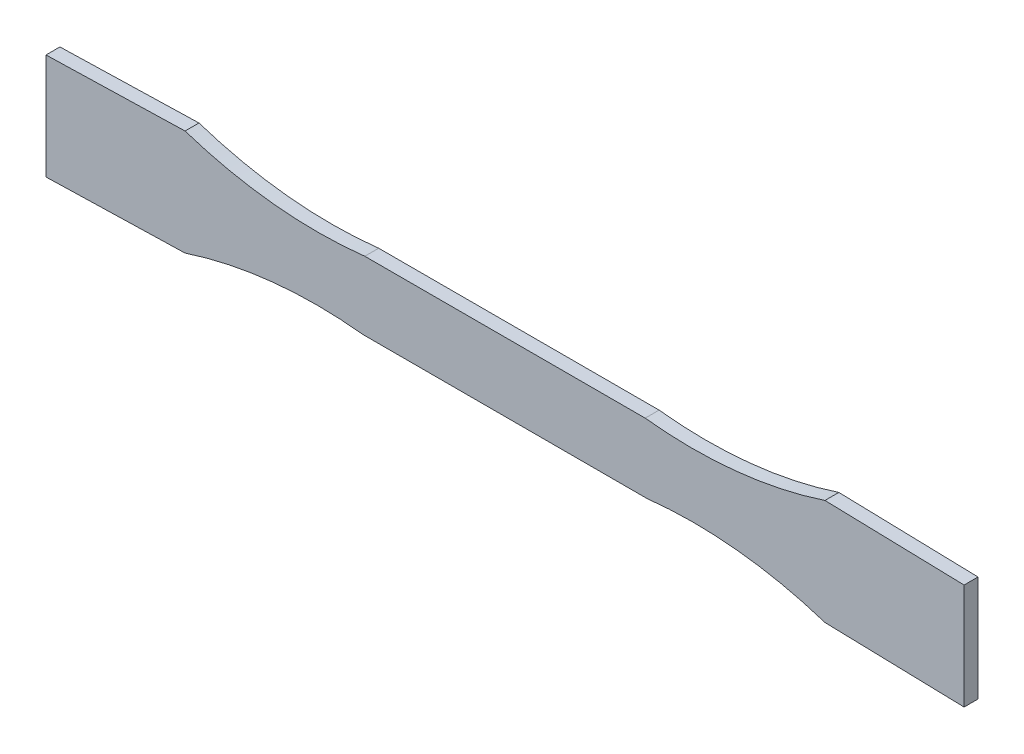
ISO-10303-21;
HEADER;
FILE_DESCRIPTION(('STEP AP214'),'2;1');
FILE_NAME('part.step','',(''),(''),'','','');
FILE_SCHEMA(('AUTOMOTIVE_DESIGN { 1 0 10303 214 1 1 1 1 }'));
ENDSEC;
DATA;
#1=APPLICATION_CONTEXT('core data for automotive mechanical design processes');
#2=APPLICATION_PROTOCOL_DEFINITION('international standard','automotive_design',2000,#1);
#3=PRODUCT_CONTEXT('',#1,'mechanical');
#4=PRODUCT('Part','Part','',(#3));
#5=PRODUCT_RELATED_PRODUCT_CATEGORY('part','',(#4));
#6=PRODUCT_DEFINITION_FORMATION('','',#4);
#7=PRODUCT_DEFINITION_CONTEXT('part definition',#1,'design');
#8=PRODUCT_DEFINITION('design','',#6,#7);
#9=PRODUCT_DEFINITION_SHAPE('','',#8);
#10=(LENGTH_UNIT() NAMED_UNIT(*) SI_UNIT(.MILLI.,.METRE.));
#11=(NAMED_UNIT(*) PLANE_ANGLE_UNIT() SI_UNIT($,.RADIAN.));
#12=(NAMED_UNIT(*) SI_UNIT($,.STERADIAN.) SOLID_ANGLE_UNIT());
#13=UNCERTAINTY_MEASURE_WITH_UNIT(LENGTH_MEASURE(1.E-05),#10,'distance_accuracy_value','');
#14=(GEOMETRIC_REPRESENTATION_CONTEXT(3) GLOBAL_UNCERTAINTY_ASSIGNED_CONTEXT((#13)) GLOBAL_UNIT_ASSIGNED_CONTEXT((#10,
#11,#12)) REPRESENTATION_CONTEXT('',''));
#15=CARTESIAN_POINT('',(0.,0.,0.));
#16=DIRECTION('',(0.,0.,1.));
#17=DIRECTION('',(1.,0.,0.));
#18=AXIS2_PLACEMENT_3D('',#15,#16,#17);
#19=CARTESIAN_POINT('',(0.306287384708204,11.6450756614139,2.5));
#20=DIRECTION('',(-0.0262927872209674,-0.999654284910615,0.));
#21=DIRECTION('',(0.999654284910615,-0.0262927872209674,0.));
#22=AXIS2_PLACEMENT_3D('',#19,#20,#21);
#23=PLANE('',#22);
#24=DIRECTION('',(-0.999654284910615,0.0262927872209674,0.));
#25=VECTOR('',#24,1.);
#26=CARTESIAN_POINT('',(0.306287384708204,11.6450756614139,0.));
#27=LINE('',#26,#25);
#28=CARTESIAN_POINT('',(118.382619236994,8.53944612919812,0.));
#29=VERTEX_POINT('',#28);
#30=CARTESIAN_POINT('',(93.3739643892406,9.19722077241228,0.));
#31=VERTEX_POINT('',#30);
#32=EDGE_CURVE('E157',#29,#31,#27,.T.);
#33=ORIENTED_EDGE('',*,*,#32,.T.);
#34=DIRECTION('',(0.,0.,-1.));
#35=VECTOR('',#34,1.);
#36=CARTESIAN_POINT('',(93.3739643892406,9.19722077241228,2.5));
#37=LINE('',#36,#35);
#38=CARTESIAN_POINT('',(93.3739643892406,9.19722077241228,2.5));
#39=VERTEX_POINT('',#38);
#40=EDGE_CURVE('E11',#39,#31,#37,.T.);
#41=ORIENTED_EDGE('',*,*,#40,.F.);
#42=DIRECTION('',(-0.999654284910615,0.0262927872209674,0.));
#43=VECTOR('',#42,1.);
#44=CARTESIAN_POINT('',(0.306287384708204,11.6450756614139,2.5));
#45=LINE('',#44,#43);
#46=CARTESIAN_POINT('',(118.382619236994,8.53944612919812,2.5));
#47=VERTEX_POINT('',#46);
#48=EDGE_CURVE('E186',#47,#39,#45,.T.);
#49=ORIENTED_EDGE('',*,*,#48,.F.);
#50=DIRECTION('',(0.,0.,-1.));
#51=VECTOR('',#50,1.);
#52=CARTESIAN_POINT('',(118.382619236994,8.53944612919812,2.5));
#53=LINE('',#52,#51);
#54=EDGE_CURVE('E53',#47,#29,#53,.T.);
#55=ORIENTED_EDGE('',*,*,#54,.T.);
#56=EDGE_LOOP('',(#33,#41,#49,#55));
#57=FACE_BOUND('',#56,.T.);
#58=ADVANCED_FACE('F37',(#57),#23,.F.);
#59=CARTESIAN_POINT('',(69.5821339937692,81.3771958793152,2.5));
#60=DIRECTION('',(0.,0.,-1.));
#61=DIRECTION('',(-1.,0.,0.));
#62=AXIS2_PLACEMENT_3D('',#59,#60,#61);
#63=CYLINDRICAL_SURFACE('',#62,76.);
#64=CARTESIAN_POINT('',(69.5821339937692,81.3771958793152,0.));
#65=DIRECTION('',(0.,0.,1.));
#66=DIRECTION('',(1.,0.,0.));
#67=AXIS2_PLACEMENT_3D('',#64,#65,#66);
#68=CIRCLE('',#67,76.);
#69=CARTESIAN_POINT('',(61.0678248014905,5.85563247535567,0.));
#70=VERTEX_POINT('',#69);
#71=EDGE_CURVE('E159',#31,#70,#68,.F.);
#72=ORIENTED_EDGE('',*,*,#71,.T.);
#73=DIRECTION('',(0.,0.,-1.));
#74=VECTOR('',#73,1.);
#75=CARTESIAN_POINT('',(61.0678248014905,5.85563247535567,2.5));
#76=LINE('',#75,#74);
#77=CARTESIAN_POINT('',(61.0678248014905,5.85563247535567,2.5));
#78=VERTEX_POINT('',#77);
#79=EDGE_CURVE('E45',#78,#70,#76,.T.);
#80=ORIENTED_EDGE('',*,*,#79,.F.);
#81=CARTESIAN_POINT('',(69.5821339937692,81.3771958793152,2.5));
#82=DIRECTION('',(0.,0.,1.));
#83=DIRECTION('',(1.,0.,0.));
#84=AXIS2_PLACEMENT_3D('',#81,#82,#83);
#85=CIRCLE('',#84,76.);
#86=EDGE_CURVE('E103',#39,#78,#85,.F.);
#87=ORIENTED_EDGE('',*,*,#86,.F.);
#88=ORIENTED_EDGE('',*,*,#40,.T.);
#89=EDGE_LOOP('',(#72,#80,#87,#88));
#90=FACE_BOUND('',#89,.T.);
#91=ADVANCED_FACE('F210',(#90),#63,.F.);
#92=CARTESIAN_POINT('',(0.,5.85563247535567,2.5));
#93=DIRECTION('',(0.,1.,0.));
#94=DIRECTION('',(0.,0.,1.));
#95=AXIS2_PLACEMENT_3D('',#92,#93,#94);
#96=PLANE('',#95);
#97=DIRECTION('',(1.,0.,0.));
#98=VECTOR('',#97,1.);
#99=CARTESIAN_POINT('',(0.,5.85563247535567,0.));
#100=LINE('',#99,#98);
#101=CARTESIAN_POINT('',(10.6759845941212,5.85563247535567,0.));
#102=VERTEX_POINT('',#101);
#103=EDGE_CURVE('E162',#102,#70,#100,.T.);
#104=ORIENTED_EDGE('',*,*,#103,.F.);
#105=DIRECTION('',(0.,0.,-1.));
#106=VECTOR('',#105,1.);
#107=CARTESIAN_POINT('',(10.6759845941212,5.85563247535567,2.5));
#108=LINE('',#107,#106);
#109=CARTESIAN_POINT('',(10.6759845941212,5.85563247535567,2.5));
#110=VERTEX_POINT('',#109);
#111=EDGE_CURVE('E203',#110,#102,#108,.T.);
#112=ORIENTED_EDGE('',*,*,#111,.F.);
#113=DIRECTION('',(1.,0.,0.));
#114=VECTOR('',#113,1.);
#115=CARTESIAN_POINT('',(0.,5.85563247535567,2.5));
#116=LINE('',#115,#114);
#117=EDGE_CURVE('E209',#110,#78,#116,.T.);
#118=ORIENTED_EDGE('',*,*,#117,.T.);
#119=ORIENTED_EDGE('',*,*,#79,.T.);
#120=EDGE_LOOP('',(#104,#112,#118,#119));
#121=FACE_BOUND('',#120,.T.);
#122=ADVANCED_FACE('F207',(#121),#96,.T.);
#123=CARTESIAN_POINT('',(2.16474503614541,81.3775418870406,2.5));
#124=DIRECTION('',(0.,0.,-1.));
#125=DIRECTION('',(-1.,0.,0.));
#126=AXIS2_PLACEMENT_3D('',#123,#124,#125);
#127=CYLINDRICAL_SURFACE('',#126,76.);
#128=CARTESIAN_POINT('',(2.16474503614541,81.3775418870406,0.));
#129=DIRECTION('',(0.,0.,1.));
#130=DIRECTION('',(1.,0.,0.));
#131=AXIS2_PLACEMENT_3D('',#128,#129,#130);
#132=CIRCLE('',#131,76.);
#133=CARTESIAN_POINT('',(-21.6260356107594,9.19722077241228,0.));
#134=VERTEX_POINT('',#133);
#135=EDGE_CURVE('E165',#134,#102,#132,.T.);
#136=ORIENTED_EDGE('',*,*,#135,.F.);
#137=DIRECTION('',(0.,0.,-1.));
#138=VECTOR('',#137,1.);
#139=CARTESIAN_POINT('',(-21.6260356107594,9.19722077241228,2.5));
#140=LINE('',#139,#138);
#141=CARTESIAN_POINT('',(-21.6260356107594,9.19722077241228,2.5));
#142=VERTEX_POINT('',#141);
#143=EDGE_CURVE('E201',#142,#134,#140,.T.);
#144=ORIENTED_EDGE('',*,*,#143,.F.);
#145=CARTESIAN_POINT('',(2.16474503614541,81.3775418870406,2.5));
#146=DIRECTION('',(0.,0.,1.));
#147=DIRECTION('',(1.,0.,0.));
#148=AXIS2_PLACEMENT_3D('',#145,#146,#147);
#149=CIRCLE('',#148,76.);
#150=EDGE_CURVE('E221',#142,#110,#149,.T.);
#151=ORIENTED_EDGE('',*,*,#150,.T.);
#152=ORIENTED_EDGE('',*,*,#111,.T.);
#153=EDGE_LOOP('',(#136,#144,#151,#152));
#154=FACE_BOUND('',#153,.T.);
#155=ADVANCED_FACE('F218',(#154),#127,.F.);
#156=CARTESIAN_POINT('',(-0.256875181504309,9.75965916024253,2.5));
#157=DIRECTION('',(-0.0263109857285662,0.999653806089884,0.));
#158=DIRECTION('',(-0.999653806089884,-0.0263109857285662,0.));
#159=AXIS2_PLACEMENT_3D('',#156,#157,#158);
#160=PLANE('',#159);
#161=DIRECTION('',(0.999653806089884,0.0263109857285662,0.));
#162=VECTOR('',#161,1.);
#163=CARTESIAN_POINT('',(-0.256875181504309,9.75965916024253,0.));
#164=LINE('',#163,#162);
#165=CARTESIAN_POINT('',(-46.6173807630065,8.53944612919812,0.));
#166=VERTEX_POINT('',#165);
#167=EDGE_CURVE('E168',#166,#134,#164,.T.);
#168=ORIENTED_EDGE('',*,*,#167,.F.);
#169=DIRECTION('',(0.,0.,-1.));
#170=VECTOR('',#169,1.);
#171=CARTESIAN_POINT('',(-46.6173807630065,8.53944612919812,2.5));
#172=LINE('',#171,#170);
#173=CARTESIAN_POINT('',(-46.6173807630065,8.53944612919812,2.5));
#174=VERTEX_POINT('',#173);
#175=EDGE_CURVE('E199',#174,#166,#172,.T.);
#176=ORIENTED_EDGE('',*,*,#175,.F.);
#177=DIRECTION('',(0.999653806089884,0.0263109857285662,0.));
#178=VECTOR('',#177,1.);
#179=CARTESIAN_POINT('',(-0.256875181504309,9.75965916024253,2.5));
#180=LINE('',#179,#178);
#181=EDGE_CURVE('E225',#174,#142,#180,.T.);
#182=ORIENTED_EDGE('',*,*,#181,.T.);
#183=ORIENTED_EDGE('',*,*,#143,.T.);
#184=EDGE_LOOP('',(#168,#176,#182,#183));
#185=FACE_BOUND('',#184,.T.);
#186=ADVANCED_FACE('F267',(#185),#160,.T.);
#187=CARTESIAN_POINT('',(-46.6173807630065,0.,2.5));
#188=DIRECTION('',(1.,0.,0.));
#189=DIRECTION('',(0.,0.,-1.));
#190=AXIS2_PLACEMENT_3D('',#187,#188,#189);
#191=PLANE('',#190);
#192=DIRECTION('',(0.,-1.,0.));
#193=VECTOR('',#192,1.);
#194=CARTESIAN_POINT('',(-46.6173807630065,0.,0.));
#195=LINE('',#194,#193);
#196=CARTESIAN_POINT('',(-46.6173807630065,-10.4605538708019,0.));
#197=VERTEX_POINT('',#196);
#198=EDGE_CURVE('E171',#166,#197,#195,.T.);
#199=ORIENTED_EDGE('',*,*,#198,.T.);
#200=DIRECTION('',(0.,0.,-1.));
#201=VECTOR('',#200,1.);
#202=CARTESIAN_POINT('',(-46.6173807630065,-10.4605538708019,2.5));
#203=LINE('',#202,#201);
#204=CARTESIAN_POINT('',(-46.6173807630065,-10.4605538708019,2.5));
#205=VERTEX_POINT('',#204);
#206=EDGE_CURVE('E196',#205,#197,#203,.T.);
#207=ORIENTED_EDGE('',*,*,#206,.F.);
#208=DIRECTION('',(0.,-1.,0.));
#209=VECTOR('',#208,1.);
#210=CARTESIAN_POINT('',(-46.6173807630065,0.,2.5));
#211=LINE('',#210,#209);
#212=EDGE_CURVE('E231',#174,#205,#211,.T.);
#213=ORIENTED_EDGE('',*,*,#212,.F.);
#214=ORIENTED_EDGE('',*,*,#175,.T.);
#215=EDGE_LOOP('',(#199,#207,#213,#214));
#216=FACE_BOUND('',#215,.T.);
#217=ADVANCED_FACE('F270',(#216),#191,.F.);
#218=CARTESIAN_POINT('',(0.24286048198091,-9.2271877483273,2.5));
#219=DIRECTION('',(-0.0263109857285662,0.999653806089884,0.));
#220=DIRECTION('',(-0.999653806089884,-0.0263109857285662,0.));
#221=AXIS2_PLACEMENT_3D('',#218,#219,#220);
#222=PLANE('',#221);
#223=DIRECTION('',(0.999653806089884,0.0263109857285662,0.));
#224=VECTOR('',#223,1.);
#225=CARTESIAN_POINT('',(0.24286048198091,-9.2271877483273,0.));
#226=LINE('',#225,#224);
#227=CARTESIAN_POINT('',(-21.6260356107594,-9.80277922758772,0.));
#228=VERTEX_POINT('',#227);
#229=EDGE_CURVE('E173',#197,#228,#226,.T.);
#230=ORIENTED_EDGE('',*,*,#229,.T.);
#231=DIRECTION('',(0.,0.,-1.));
#232=VECTOR('',#231,1.);
#233=CARTESIAN_POINT('',(-21.6260356107594,-9.80277922758772,2.5));
#234=LINE('',#233,#232);
#235=CARTESIAN_POINT('',(-21.6260356107594,-9.80277922758772,2.5));
#236=VERTEX_POINT('',#235);
#237=EDGE_CURVE('E193',#236,#228,#234,.T.);
#238=ORIENTED_EDGE('',*,*,#237,.F.);
#239=DIRECTION('',(0.999653806089884,0.0263109857285662,0.));
#240=VECTOR('',#239,1.);
#241=CARTESIAN_POINT('',(0.24286048198091,-9.2271877483273,2.5));
#242=LINE('',#241,#240);
#243=EDGE_CURVE('E233',#205,#236,#242,.T.);
#244=ORIENTED_EDGE('',*,*,#243,.F.);
#245=ORIENTED_EDGE('',*,*,#206,.T.);
#246=EDGE_LOOP('',(#230,#238,#244,#245));
#247=FACE_BOUND('',#246,.T.);
#248=ADVANCED_FACE('F274',(#247),#222,.F.);
#249=CARTESIAN_POINT('',(2.00700801727326,-82.0348998449108,2.5));
#250=DIRECTION('',(0.,0.,-1.));
#251=DIRECTION('',(-1.,0.,0.));
#252=AXIS2_PLACEMENT_3D('',#249,#250,#251);
#253=CYLINDRICAL_SURFACE('',#252,76.);
#254=CARTESIAN_POINT('',(2.00700801727326,-82.0348998449108,0.));
#255=DIRECTION('',(0.,0.,1.));
#256=DIRECTION('',(1.,0.,0.));
#257=AXIS2_PLACEMENT_3D('',#254,#255,#256);
#258=CIRCLE('',#257,76.);
#259=CARTESIAN_POINT('',(10.3532472068132,-6.49457755680435,0.));
#260=VERTEX_POINT('',#259);
#261=EDGE_CURVE('E175',#228,#260,#258,.F.);
#262=ORIENTED_EDGE('',*,*,#261,.T.);
#263=DIRECTION('',(0.,0.,-1.));
#264=VECTOR('',#263,1.);
#265=CARTESIAN_POINT('',(10.3532472068132,-6.49457755680435,2.5));
#266=LINE('',#265,#264);
#267=CARTESIAN_POINT('',(10.3532472068132,-6.49457755680435,2.5));
#268=VERTEX_POINT('',#267);
#269=EDGE_CURVE('E190',#268,#260,#266,.T.);
#270=ORIENTED_EDGE('',*,*,#269,.F.);
#271=CARTESIAN_POINT('',(2.00700801727326,-82.0348998449108,2.5));
#272=DIRECTION('',(0.,0.,1.));
#273=DIRECTION('',(1.,0.,0.));
#274=AXIS2_PLACEMENT_3D('',#271,#272,#273);
#275=CIRCLE('',#274,76.);
#276=EDGE_CURVE('E235',#236,#268,#275,.F.);
#277=ORIENTED_EDGE('',*,*,#276,.F.);
#278=ORIENTED_EDGE('',*,*,#237,.T.);
#279=EDGE_LOOP('',(#262,#270,#277,#278));
#280=FACE_BOUND('',#279,.T.);
#281=ADVANCED_FACE('F241',(#280),#253,.F.);
#282=CARTESIAN_POINT('',(0.,-6.49457755680435,2.5));
#283=DIRECTION('',(0.,1.,0.));
#284=DIRECTION('',(0.,0.,1.));
#285=AXIS2_PLACEMENT_3D('',#282,#283,#284);
#286=PLANE('',#285);
#287=DIRECTION('',(1.,0.,0.));
#288=VECTOR('',#287,1.);
#289=CARTESIAN_POINT('',(0.,-6.49457755680435,0.));
#290=LINE('',#289,#288);
#291=CARTESIAN_POINT('',(61.3905621887986,-6.49457755680435,0.));
#292=VERTEX_POINT('',#291);
#293=EDGE_CURVE('E177',#260,#292,#290,.T.);
#294=ORIENTED_EDGE('',*,*,#293,.T.);
#295=DIRECTION('',(0.,0.,-1.));
#296=VECTOR('',#295,1.);
#297=CARTESIAN_POINT('',(61.3905621887986,-6.49457755680435,2.5));
#298=LINE('',#297,#296);
#299=CARTESIAN_POINT('',(61.3905621887986,-6.49457755680435,2.5));
#300=VERTEX_POINT('',#299);
#301=EDGE_CURVE('E140',#300,#292,#298,.T.);
#302=ORIENTED_EDGE('',*,*,#301,.F.);
#303=DIRECTION('',(1.,0.,0.));
#304=VECTOR('',#303,1.);
#305=CARTESIAN_POINT('',(0.,-6.49457755680435,2.5));
#306=LINE('',#305,#304);
#307=EDGE_CURVE('E148',#268,#300,#306,.T.);
#308=ORIENTED_EDGE('',*,*,#307,.F.);
#309=ORIENTED_EDGE('',*,*,#269,.T.);
#310=EDGE_LOOP('',(#294,#302,#308,#309));
#311=FACE_BOUND('',#310,.T.);
#312=ADVANCED_FACE('F245',(#311),#286,.F.);
#313=CARTESIAN_POINT('',(69.7528173878932,-82.0331285621368,2.5));
#314=DIRECTION('',(0.,0.,-1.));
#315=DIRECTION('',(-1.,0.,0.));
#316=AXIS2_PLACEMENT_3D('',#313,#314,#315);
#317=CYLINDRICAL_SURFACE('',#316,76.);
#318=CARTESIAN_POINT('',(69.7528173878932,-82.0331285621368,0.));
#319=DIRECTION('',(0.,0.,1.));
#320=DIRECTION('',(1.,0.,0.));
#321=AXIS2_PLACEMENT_3D('',#318,#319,#320);
#322=CIRCLE('',#321,76.);
#323=CARTESIAN_POINT('',(93.3912740847464,-9.80277922758773,0.));
#324=VERTEX_POINT('',#323);
#325=EDGE_CURVE('E136',#324,#292,#322,.T.);
#326=ORIENTED_EDGE('',*,*,#325,.F.);
#327=DIRECTION('',(0.,0.,-1.));
#328=VECTOR('',#327,1.);
#329=CARTESIAN_POINT('',(93.3912740847464,-9.80277922758773,2.5));
#330=LINE('',#329,#328);
#331=CARTESIAN_POINT('',(93.3912740847464,-9.80277922758773,2.5));
#332=VERTEX_POINT('',#331);
#333=EDGE_CURVE('E131',#332,#324,#330,.T.);
#334=ORIENTED_EDGE('',*,*,#333,.F.);
#335=CARTESIAN_POINT('',(69.7528173878932,-82.0331285621368,2.5));
#336=DIRECTION('',(0.,0.,1.));
#337=DIRECTION('',(1.,0.,0.));
#338=AXIS2_PLACEMENT_3D('',#335,#336,#337);
#339=CIRCLE('',#338,76.);
#340=EDGE_CURVE('E134',#332,#300,#339,.T.);
#341=ORIENTED_EDGE('',*,*,#340,.T.);
#342=ORIENTED_EDGE('',*,*,#301,.T.);
#343=EDGE_LOOP('',(#326,#334,#341,#342));
#344=FACE_BOUND('',#343,.T.);
#345=ADVANCED_FACE('F133',(#344),#317,.F.);
#346=CARTESIAN_POINT('',(-0.193179706025324,-7.33962727127612,2.5));
#347=DIRECTION('',(-0.0263109857285661,-0.999653806089884,0.));
#348=DIRECTION('',(0.999653806089884,-0.0263109857285661,0.));
#349=AXIS2_PLACEMENT_3D('',#346,#347,#348);
#350=PLANE('',#349);
#351=DIRECTION('',(-0.999653806089884,0.0263109857285661,0.));
#352=VECTOR('',#351,1.);
#353=CARTESIAN_POINT('',(-0.193179706025324,-7.33962727127612,0.));
#354=LINE('',#353,#352);
#355=CARTESIAN_POINT('',(118.382619236994,-10.4605538708019,0.));
#356=VERTEX_POINT('',#355);
#357=EDGE_CURVE('E181',#356,#324,#354,.T.);
#358=ORIENTED_EDGE('',*,*,#357,.F.);
#359=DIRECTION('',(0.,0.,-1.));
#360=VECTOR('',#359,1.);
#361=CARTESIAN_POINT('',(118.382619236994,-10.4605538708019,2.5));
#362=LINE('',#361,#360);
#363=CARTESIAN_POINT('',(118.382619236994,-10.4605538708019,2.5));
#364=VERTEX_POINT('',#363);
#365=EDGE_CURVE('E91',#364,#356,#362,.T.);
#366=ORIENTED_EDGE('',*,*,#365,.F.);
#367=DIRECTION('',(-0.999653806089884,0.0263109857285661,0.));
#368=VECTOR('',#367,1.);
#369=CARTESIAN_POINT('',(-0.193179706025324,-7.33962727127612,2.5));
#370=LINE('',#369,#368);
#371=EDGE_CURVE('E146',#364,#332,#370,.T.);
#372=ORIENTED_EDGE('',*,*,#371,.T.);
#373=ORIENTED_EDGE('',*,*,#333,.T.);
#374=EDGE_LOOP('',(#358,#366,#372,#373));
#375=FACE_BOUND('',#374,.T.);
#376=ADVANCED_FACE('F151',(#375),#350,.T.);
#377=CARTESIAN_POINT('',(118.382619236994,0.,2.5));
#378=DIRECTION('',(1.,0.,0.));
#379=DIRECTION('',(0.,0.,-1.));
#380=AXIS2_PLACEMENT_3D('',#377,#378,#379);
#381=PLANE('',#380);
#382=DIRECTION('',(0.,-1.,0.));
#383=VECTOR('',#382,1.);
#384=CARTESIAN_POINT('',(118.382619236994,0.,0.));
#385=LINE('',#384,#383);
#386=EDGE_CURVE('E183',#29,#356,#385,.T.);
#387=ORIENTED_EDGE('',*,*,#386,.F.);
#388=ORIENTED_EDGE('',*,*,#54,.F.);
#389=DIRECTION('',(0.,-1.,0.));
#390=VECTOR('',#389,1.);
#391=CARTESIAN_POINT('',(118.382619236994,0.,2.5));
#392=LINE('',#391,#390);
#393=EDGE_CURVE('E152',#47,#364,#392,.T.);
#394=ORIENTED_EDGE('',*,*,#393,.T.);
#395=ORIENTED_EDGE('',*,*,#365,.T.);
#396=EDGE_LOOP('',(#387,#388,#394,#395));
#397=FACE_BOUND('',#396,.T.);
#398=ADVANCED_FACE('F246',(#397),#381,.T.);
#399=CARTESIAN_POINT('',(0.,0.,2.5));
#400=DIRECTION('',(0.,0.,1.));
#401=DIRECTION('',(1.,0.,0.));
#402=AXIS2_PLACEMENT_3D('',#399,#400,#401);
#403=PLANE('',#402);
#404=ORIENTED_EDGE('',*,*,#48,.T.);
#405=ORIENTED_EDGE('',*,*,#86,.T.);
#406=ORIENTED_EDGE('',*,*,#117,.F.);
#407=ORIENTED_EDGE('',*,*,#150,.F.);
#408=ORIENTED_EDGE('',*,*,#181,.F.);
#409=ORIENTED_EDGE('',*,*,#212,.T.);
#410=ORIENTED_EDGE('',*,*,#243,.T.);
#411=ORIENTED_EDGE('',*,*,#276,.T.);
#412=ORIENTED_EDGE('',*,*,#307,.T.);
#413=ORIENTED_EDGE('',*,*,#340,.F.);
#414=ORIENTED_EDGE('',*,*,#371,.F.);
#415=ORIENTED_EDGE('',*,*,#393,.F.);
#416=EDGE_LOOP('',(#404,#405,#406,#407,#408,#409,#410,#411,#412,#413,#414,#415));
#417=FACE_BOUND('',#416,.T.);
#418=ADVANCED_FACE('F144',(#417),#403,.T.);
#419=CARTESIAN_POINT('',(0.,0.,0.));
#420=DIRECTION('',(0.,0.,1.));
#421=DIRECTION('',(1.,0.,0.));
#422=AXIS2_PLACEMENT_3D('',#419,#420,#421);
#423=PLANE('',#422);
#424=ORIENTED_EDGE('',*,*,#32,.F.);
#425=ORIENTED_EDGE('',*,*,#386,.T.);
#426=ORIENTED_EDGE('',*,*,#357,.T.);
#427=ORIENTED_EDGE('',*,*,#325,.T.);
#428=ORIENTED_EDGE('',*,*,#293,.F.);
#429=ORIENTED_EDGE('',*,*,#261,.F.);
#430=ORIENTED_EDGE('',*,*,#229,.F.);
#431=ORIENTED_EDGE('',*,*,#198,.F.);
#432=ORIENTED_EDGE('',*,*,#167,.T.);
#433=ORIENTED_EDGE('',*,*,#135,.T.);
#434=ORIENTED_EDGE('',*,*,#103,.T.);
#435=ORIENTED_EDGE('',*,*,#71,.F.);
#436=EDGE_LOOP('',(#424,#425,#426,#427,#428,#429,#430,#431,#432,#433,#434,#435));
#437=FACE_BOUND('',#436,.T.);
#438=ADVANCED_FACE('F213',(#437),#423,.F.);
#439=CLOSED_SHELL('',(#58,#91,#122,#155,#186,#217,#248,#281,#312,#345,#376,#398,#418,#438));
#440=MANIFOLD_SOLID_BREP('B2',#439);
#441=ADVANCED_BREP_SHAPE_REPRESENTATION('',(#18,#440),#14);
#442=SHAPE_DEFINITION_REPRESENTATION(#9,#441);
ENDSEC;
END-ISO-10303-21;
